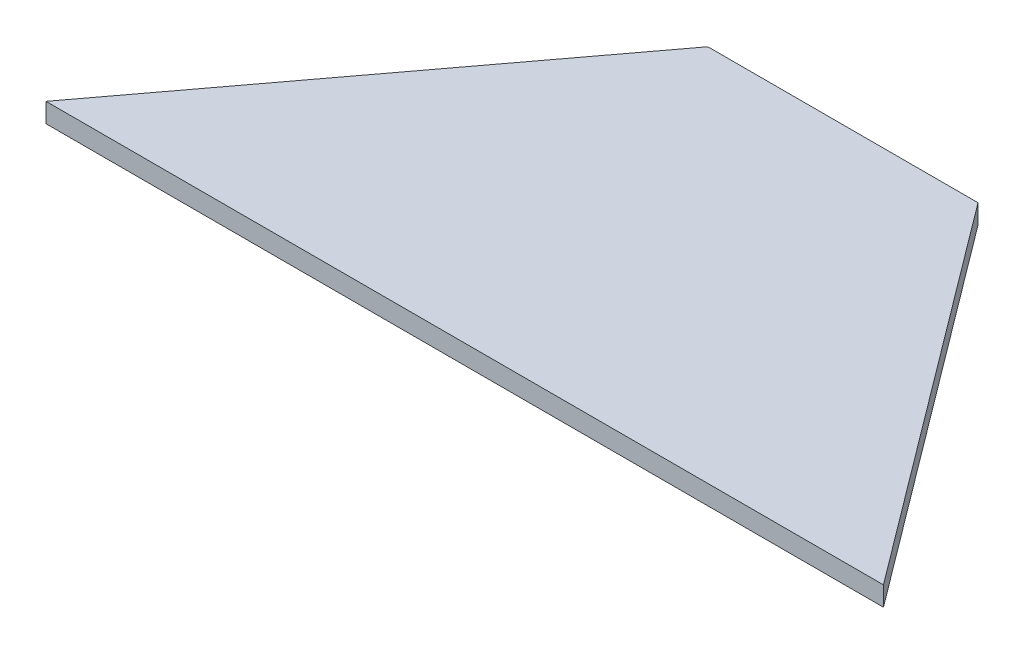
ISO-10303-21;
HEADER;
FILE_DESCRIPTION(('STEP AP214'),'2;1');
FILE_NAME('part.step','',(''),(''),'','','');
FILE_SCHEMA(('AUTOMOTIVE_DESIGN { 1 0 10303 214 1 1 1 1 }'));
ENDSEC;
DATA;
#1=APPLICATION_CONTEXT('core data for automotive mechanical design processes');
#2=APPLICATION_PROTOCOL_DEFINITION('international standard','automotive_design',2000,#1);
#3=PRODUCT_CONTEXT('',#1,'mechanical');
#4=PRODUCT('Part','Part','',(#3));
#5=PRODUCT_RELATED_PRODUCT_CATEGORY('part','',(#4));
#6=PRODUCT_DEFINITION_FORMATION('','',#4);
#7=PRODUCT_DEFINITION_CONTEXT('part definition',#1,'design');
#8=PRODUCT_DEFINITION('design','',#6,#7);
#9=PRODUCT_DEFINITION_SHAPE('','',#8);
#10=(LENGTH_UNIT() NAMED_UNIT(*) SI_UNIT(.MILLI.,.METRE.));
#11=(NAMED_UNIT(*) PLANE_ANGLE_UNIT() SI_UNIT($,.RADIAN.));
#12=(NAMED_UNIT(*) SI_UNIT($,.STERADIAN.) SOLID_ANGLE_UNIT());
#13=UNCERTAINTY_MEASURE_WITH_UNIT(LENGTH_MEASURE(1.E-05),#10,'distance_accuracy_value','');
#14=(GEOMETRIC_REPRESENTATION_CONTEXT(3) GLOBAL_UNCERTAINTY_ASSIGNED_CONTEXT((#13)) GLOBAL_UNIT_ASSIGNED_CONTEXT((#10,
#11,#12)) REPRESENTATION_CONTEXT('',''));
#15=CARTESIAN_POINT('',(0.,0.,0.));
#16=DIRECTION('',(0.,0.,1.));
#17=DIRECTION('',(1.,0.,0.));
#18=AXIS2_PLACEMENT_3D('',#15,#16,#17);
#19=CARTESIAN_POINT('',(461.264,18.25625,345.948));
#20=DIRECTION('',(-0.8,0.,-0.6));
#21=DIRECTION('',(-0.6,0.,0.8));
#22=AXIS2_PLACEMENT_3D('',#19,#20,#21);
#23=PLANE('',#22);
#24=DIRECTION('',(0.6,0.,-0.8));
#25=VECTOR('',#24,1.);
#26=CARTESIAN_POINT('',(461.264,0.,345.948));
#27=LINE('',#26,#25);
#28=CARTESIAN_POINT('',(-393.7,0.,1485.9));
#29=VERTEX_POINT('',#28);
#30=CARTESIAN_POINT('',(-127.,0.,1130.3));
#31=VERTEX_POINT('',#30);
#32=EDGE_CURVE('E98',#29,#31,#27,.T.);
#33=ORIENTED_EDGE('',*,*,#32,.F.);
#34=DIRECTION('',(0.,-1.,0.));
#35=VECTOR('',#34,1.);
#36=CARTESIAN_POINT('',(-393.7,18.25625,1485.9));
#37=LINE('',#36,#35);
#38=CARTESIAN_POINT('',(-393.7,18.25625,1485.9));
#39=VERTEX_POINT('',#38);
#40=EDGE_CURVE('E11',#39,#29,#37,.T.);
#41=ORIENTED_EDGE('',*,*,#40,.F.);
#42=DIRECTION('',(0.6,0.,-0.8));
#43=VECTOR('',#42,1.);
#44=CARTESIAN_POINT('',(461.264,18.25625,345.948));
#45=LINE('',#44,#43);
#46=CARTESIAN_POINT('',(-127.,18.25625,1130.3));
#47=VERTEX_POINT('',#46);
#48=EDGE_CURVE('E90',#39,#47,#45,.T.);
#49=ORIENTED_EDGE('',*,*,#48,.T.);
#50=DIRECTION('',(0.,-1.,0.));
#51=VECTOR('',#50,1.);
#52=CARTESIAN_POINT('',(-127.,18.25625,1130.3));
#53=LINE('',#52,#51);
#54=EDGE_CURVE('E51',#47,#31,#53,.T.);
#55=ORIENTED_EDGE('',*,*,#54,.T.);
#56=EDGE_LOOP('',(#33,#41,#49,#55));
#57=FACE_BOUND('',#56,.T.);
#58=ADVANCED_FACE('F35',(#57),#23,.T.);
#59=CARTESIAN_POINT('',(0.,18.25625,1485.9));
#60=DIRECTION('',(0.,0.,1.));
#61=DIRECTION('',(1.,0.,0.));
#62=AXIS2_PLACEMENT_3D('',#59,#60,#61);
#63=PLANE('',#62);
#64=DIRECTION('',(-1.,0.,0.));
#65=VECTOR('',#64,1.);
#66=CARTESIAN_POINT('',(0.,0.,1485.9));
#67=LINE('',#66,#65);
#68=CARTESIAN_POINT('',(393.7,0.,1485.9));
#69=VERTEX_POINT('',#68);
#70=EDGE_CURVE('E81',#69,#29,#67,.T.);
#71=ORIENTED_EDGE('',*,*,#70,.F.);
#72=DIRECTION('',(0.,-1.,0.));
#73=VECTOR('',#72,1.);
#74=CARTESIAN_POINT('',(393.7,18.25625,1485.9));
#75=LINE('',#74,#73);
#76=CARTESIAN_POINT('',(393.7,18.25625,1485.9));
#77=VERTEX_POINT('',#76);
#78=EDGE_CURVE('E43',#77,#69,#75,.T.);
#79=ORIENTED_EDGE('',*,*,#78,.F.);
#80=DIRECTION('',(-1.,0.,0.));
#81=VECTOR('',#80,1.);
#82=CARTESIAN_POINT('',(0.,18.25625,1485.9));
#83=LINE('',#82,#81);
#84=EDGE_CURVE('E79',#77,#39,#83,.T.);
#85=ORIENTED_EDGE('',*,*,#84,.T.);
#86=ORIENTED_EDGE('',*,*,#40,.T.);
#87=EDGE_LOOP('',(#71,#79,#85,#86));
#88=FACE_BOUND('',#87,.T.);
#89=ADVANCED_FACE('F78',(#88),#63,.T.);
#90=CARTESIAN_POINT('',(-461.264,18.25625,345.948));
#91=DIRECTION('',(0.8,0.,-0.6));
#92=DIRECTION('',(-0.6,0.,-0.8));
#93=AXIS2_PLACEMENT_3D('',#90,#91,#92);
#94=PLANE('',#93);
#95=DIRECTION('',(0.6,0.,0.8));
#96=VECTOR('',#95,1.);
#97=CARTESIAN_POINT('',(-461.264,0.,345.948));
#98=LINE('',#97,#96);
#99=CARTESIAN_POINT('',(127.,0.,1130.3));
#100=VERTEX_POINT('',#99);
#101=EDGE_CURVE('E101',#100,#69,#98,.T.);
#102=ORIENTED_EDGE('',*,*,#101,.F.);
#103=DIRECTION('',(0.,-1.,0.));
#104=VECTOR('',#103,1.);
#105=CARTESIAN_POINT('',(127.,18.25625,1130.3));
#106=LINE('',#105,#104);
#107=CARTESIAN_POINT('',(127.,18.25625,1130.3));
#108=VERTEX_POINT('',#107);
#109=EDGE_CURVE('E64',#108,#100,#106,.T.);
#110=ORIENTED_EDGE('',*,*,#109,.F.);
#111=DIRECTION('',(0.6,0.,0.8));
#112=VECTOR('',#111,1.);
#113=CARTESIAN_POINT('',(-461.264,18.25625,345.948));
#114=LINE('',#113,#112);
#115=EDGE_CURVE('E89',#108,#77,#114,.T.);
#116=ORIENTED_EDGE('',*,*,#115,.T.);
#117=ORIENTED_EDGE('',*,*,#78,.T.);
#118=EDGE_LOOP('',(#102,#110,#116,#117));
#119=FACE_BOUND('',#118,.T.);
#120=ADVANCED_FACE('F92',(#119),#94,.T.);
#121=CARTESIAN_POINT('',(0.,18.25625,1130.3));
#122=DIRECTION('',(0.,0.,-1.));
#123=DIRECTION('',(-1.,0.,0.));
#124=AXIS2_PLACEMENT_3D('',#121,#122,#123);
#125=PLANE('',#124);
#126=DIRECTION('',(1.,0.,0.));
#127=VECTOR('',#126,1.);
#128=CARTESIAN_POINT('',(0.,0.,1130.3));
#129=LINE('',#128,#127);
#130=EDGE_CURVE('E103',#31,#100,#129,.T.);
#131=ORIENTED_EDGE('',*,*,#130,.F.);
#132=ORIENTED_EDGE('',*,*,#54,.F.);
#133=DIRECTION('',(1.,0.,0.));
#134=VECTOR('',#133,1.);
#135=CARTESIAN_POINT('',(0.,18.25625,1130.3));
#136=LINE('',#135,#134);
#137=EDGE_CURVE('E93',#47,#108,#136,.T.);
#138=ORIENTED_EDGE('',*,*,#137,.T.);
#139=ORIENTED_EDGE('',*,*,#109,.T.);
#140=EDGE_LOOP('',(#131,#132,#138,#139));
#141=FACE_BOUND('',#140,.T.);
#142=ADVANCED_FACE('F108',(#141),#125,.T.);
#143=CARTESIAN_POINT('',(0.,18.25625,0.));
#144=DIRECTION('',(0.,1.,0.));
#145=DIRECTION('',(0.,0.,1.));
#146=AXIS2_PLACEMENT_3D('',#143,#144,#145);
#147=PLANE('',#146);
#148=ORIENTED_EDGE('',*,*,#48,.F.);
#149=ORIENTED_EDGE('',*,*,#84,.F.);
#150=ORIENTED_EDGE('',*,*,#115,.F.);
#151=ORIENTED_EDGE('',*,*,#137,.F.);
#152=EDGE_LOOP('',(#148,#149,#150,#151));
#153=FACE_BOUND('',#152,.T.);
#154=ADVANCED_FACE('F87',(#153),#147,.T.);
#155=CARTESIAN_POINT('',(0.,0.,0.));
#156=DIRECTION('',(0.,1.,0.));
#157=DIRECTION('',(0.,0.,1.));
#158=AXIS2_PLACEMENT_3D('',#155,#156,#157);
#159=PLANE('',#158);
#160=ORIENTED_EDGE('',*,*,#32,.T.);
#161=ORIENTED_EDGE('',*,*,#130,.T.);
#162=ORIENTED_EDGE('',*,*,#101,.T.);
#163=ORIENTED_EDGE('',*,*,#70,.T.);
#164=EDGE_LOOP('',(#160,#161,#162,#163));
#165=FACE_BOUND('',#164,.T.);
#166=ADVANCED_FACE('F115',(#165),#159,.F.);
#167=CLOSED_SHELL('',(#58,#89,#120,#142,#154,#166));
#168=MANIFOLD_SOLID_BREP('B2',#167);
#169=ADVANCED_BREP_SHAPE_REPRESENTATION('',(#18,#168),#14);
#170=SHAPE_DEFINITION_REPRESENTATION(#9,#169);
ENDSEC;
END-ISO-10303-21;
